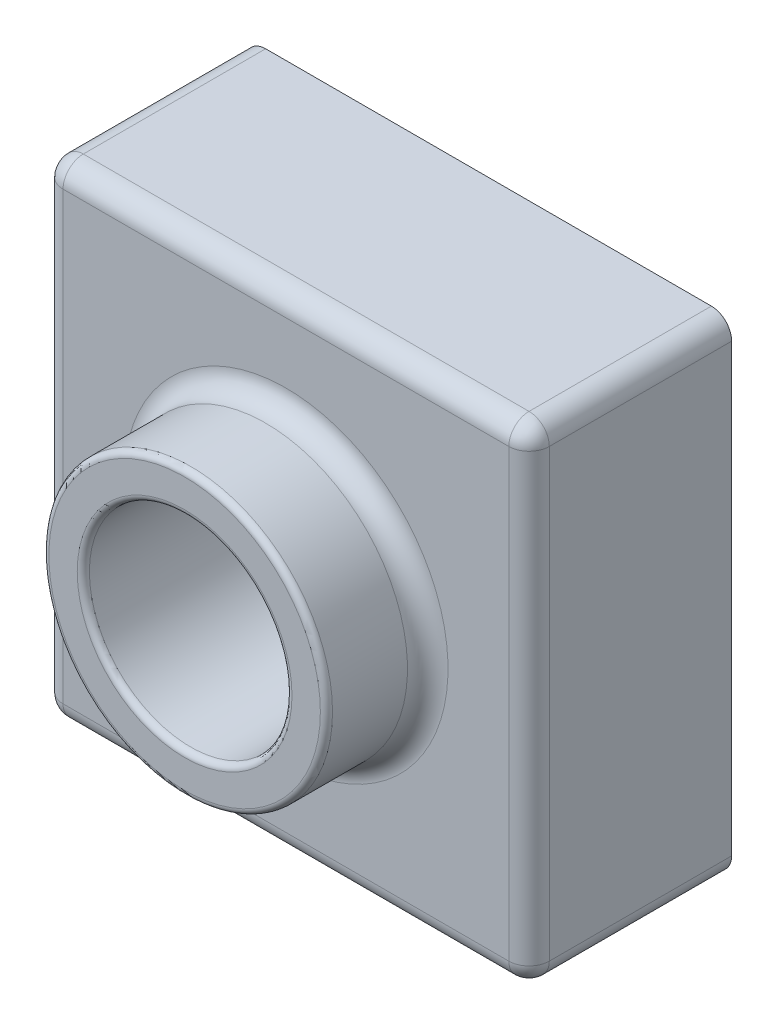
ISO-10303-21;
HEADER;
FILE_DESCRIPTION(('STEP AP214'),'2;1');
FILE_NAME('part.step','',(''),(''),'','','');
FILE_SCHEMA(('AUTOMOTIVE_DESIGN { 1 0 10303 214 1 1 1 1 }'));
ENDSEC;
DATA;
#1=APPLICATION_CONTEXT('core data for automotive mechanical design processes');
#2=APPLICATION_PROTOCOL_DEFINITION('international standard','automotive_design',2000,#1);
#3=PRODUCT_CONTEXT('',#1,'mechanical');
#4=PRODUCT('Part','Part','',(#3));
#5=PRODUCT_RELATED_PRODUCT_CATEGORY('part','',(#4));
#6=PRODUCT_DEFINITION_FORMATION('','',#4);
#7=PRODUCT_DEFINITION_CONTEXT('part definition',#1,'design');
#8=PRODUCT_DEFINITION('design','',#6,#7);
#9=PRODUCT_DEFINITION_SHAPE('','',#8);
#10=(LENGTH_UNIT() NAMED_UNIT(*) SI_UNIT(.MILLI.,.METRE.));
#11=(NAMED_UNIT(*) PLANE_ANGLE_UNIT() SI_UNIT($,.RADIAN.));
#12=(NAMED_UNIT(*) SI_UNIT($,.STERADIAN.) SOLID_ANGLE_UNIT());
#13=UNCERTAINTY_MEASURE_WITH_UNIT(LENGTH_MEASURE(1.E-05),#10,'distance_accuracy_value','');
#14=(GEOMETRIC_REPRESENTATION_CONTEXT(3) GLOBAL_UNCERTAINTY_ASSIGNED_CONTEXT((#13)) GLOBAL_UNIT_ASSIGNED_CONTEXT((#10,
#11,#12)) REPRESENTATION_CONTEXT('',''));
#15=CARTESIAN_POINT('',(0.,0.,0.));
#16=DIRECTION('',(0.,0.,1.));
#17=DIRECTION('',(1.,0.,0.));
#18=AXIS2_PLACEMENT_3D('',#15,#16,#17);
#19=CARTESIAN_POINT('',(0.,0.,0.));
#20=DIRECTION('',(0.,0.,-1.));
#21=DIRECTION('',(-1.,0.,0.));
#22=AXIS2_PLACEMENT_3D('',#19,#20,#21);
#23=PLANE('',#22);
#24=DIRECTION('',(0.,1.,0.));
#25=VECTOR('',#24,1.);
#26=CARTESIAN_POINT('',(120.,0.,0.));
#27=LINE('',#26,#25);
#28=CARTESIAN_POINT('',(120.,5.,0.));
#29=VERTEX_POINT('',#28);
#30=CARTESIAN_POINT('',(120.,115.,0.));
#31=VERTEX_POINT('',#30);
#32=EDGE_CURVE('E304',#29,#31,#27,.T.);
#33=ORIENTED_EDGE('',*,*,#32,.F.);
#34=CARTESIAN_POINT('',(115.,5.,0.));
#35=DIRECTION('',(0.,0.,-1.));
#36=DIRECTION('',(-1.,0.,0.));
#37=AXIS2_PLACEMENT_3D('',#34,#35,#36);
#38=CIRCLE('',#37,5.);
#39=CARTESIAN_POINT('',(115.,0.,0.));
#40=VERTEX_POINT('',#39);
#41=EDGE_CURVE('E378',#29,#40,#38,.T.);
#42=ORIENTED_EDGE('',*,*,#41,.T.);
#43=DIRECTION('',(1.,0.,0.));
#44=VECTOR('',#43,1.);
#45=CARTESIAN_POINT('',(0.,0.,0.));
#46=LINE('',#45,#44);
#47=CARTESIAN_POINT('',(5.,0.,0.));
#48=VERTEX_POINT('',#47);
#49=EDGE_CURVE('E300',#48,#40,#46,.T.);
#50=ORIENTED_EDGE('',*,*,#49,.F.);
#51=CARTESIAN_POINT('',(5.,5.,0.));
#52=DIRECTION('',(0.,0.,-1.));
#53=DIRECTION('',(-1.,0.,0.));
#54=AXIS2_PLACEMENT_3D('',#51,#52,#53);
#55=CIRCLE('',#54,5.);
#56=CARTESIAN_POINT('',(0.,5.,0.));
#57=VERTEX_POINT('',#56);
#58=EDGE_CURVE('E369',#48,#57,#55,.T.);
#59=ORIENTED_EDGE('',*,*,#58,.T.);
#60=DIRECTION('',(0.,-1.,0.));
#61=VECTOR('',#60,1.);
#62=CARTESIAN_POINT('',(0.,0.,0.));
#63=LINE('',#62,#61);
#64=CARTESIAN_POINT('',(0.,115.,0.));
#65=VERTEX_POINT('',#64);
#66=EDGE_CURVE('E295',#65,#57,#63,.T.);
#67=ORIENTED_EDGE('',*,*,#66,.F.);
#68=CARTESIAN_POINT('',(5.,115.,0.));
#69=DIRECTION('',(0.,0.,-1.));
#70=DIRECTION('',(-1.,0.,0.));
#71=AXIS2_PLACEMENT_3D('',#68,#69,#70);
#72=CIRCLE('',#71,5.);
#73=CARTESIAN_POINT('',(5.,120.,0.));
#74=VERTEX_POINT('',#73);
#75=EDGE_CURVE('E372',#65,#74,#72,.T.);
#76=ORIENTED_EDGE('',*,*,#75,.T.);
#77=DIRECTION('',(-1.,0.,0.));
#78=VECTOR('',#77,1.);
#79=CARTESIAN_POINT('',(0.,120.,0.));
#80=LINE('',#79,#78);
#81=CARTESIAN_POINT('',(115.,120.,0.));
#82=VERTEX_POINT('',#81);
#83=EDGE_CURVE('E308',#82,#74,#80,.T.);
#84=ORIENTED_EDGE('',*,*,#83,.F.);
#85=CARTESIAN_POINT('',(115.,115.,0.));
#86=DIRECTION('',(0.,0.,-1.));
#87=DIRECTION('',(-1.,0.,0.));
#88=AXIS2_PLACEMENT_3D('',#85,#86,#87);
#89=CIRCLE('',#88,5.);
#90=EDGE_CURVE('E375',#82,#31,#89,.T.);
#91=ORIENTED_EDGE('',*,*,#90,.T.);
#92=EDGE_LOOP('',(#33,#42,#50,#59,#67,#76,#84,#91));
#93=FACE_BOUND('',#92,.T.);
#94=CARTESIAN_POINT('',(115.,5.,0.));
#95=DIRECTION('',(0.,0.,-1.));
#96=DIRECTION('',(-1.,0.,0.));
#97=AXIS2_PLACEMENT_3D('',#94,#95,#96);
#98=CIRCLE('',#97,3.);
#99=CARTESIAN_POINT('',(118.,5.,0.));
#100=VERTEX_POINT('',#99);
#101=CARTESIAN_POINT('',(115.,2.,0.));
#102=VERTEX_POINT('',#101);
#103=EDGE_CURVE('E258',#100,#102,#98,.T.);
#104=ORIENTED_EDGE('',*,*,#103,.F.);
#105=DIRECTION('',(0.,1.,0.));
#106=VECTOR('',#105,1.);
#107=CARTESIAN_POINT('',(118.,0.,0.));
#108=LINE('',#107,#106);
#109=CARTESIAN_POINT('',(118.,115.,0.));
#110=VERTEX_POINT('',#109);
#111=EDGE_CURVE('E274',#100,#110,#108,.T.);
#112=ORIENTED_EDGE('',*,*,#111,.T.);
#113=CARTESIAN_POINT('',(115.,115.,0.));
#114=DIRECTION('',(0.,0.,-1.));
#115=DIRECTION('',(-1.,0.,0.));
#116=AXIS2_PLACEMENT_3D('',#113,#114,#115);
#117=CIRCLE('',#116,3.);
#118=CARTESIAN_POINT('',(115.,118.,0.));
#119=VERTEX_POINT('',#118);
#120=EDGE_CURVE('E270',#119,#110,#117,.T.);
#121=ORIENTED_EDGE('',*,*,#120,.F.);
#122=DIRECTION('',(-1.,0.,0.));
#123=VECTOR('',#122,1.);
#124=CARTESIAN_POINT('',(0.,118.,0.));
#125=LINE('',#124,#123);
#126=CARTESIAN_POINT('',(5.,118.,0.));
#127=VERTEX_POINT('',#126);
#128=EDGE_CURVE('E59',#119,#127,#125,.T.);
#129=ORIENTED_EDGE('',*,*,#128,.T.);
#130=CARTESIAN_POINT('',(5.,115.,0.));
#131=DIRECTION('',(0.,0.,-1.));
#132=DIRECTION('',(-1.,0.,0.));
#133=AXIS2_PLACEMENT_3D('',#130,#131,#132);
#134=CIRCLE('',#133,3.);
#135=CARTESIAN_POINT('',(2.,115.,0.));
#136=VERTEX_POINT('',#135);
#137=EDGE_CURVE('E267',#136,#127,#134,.T.);
#138=ORIENTED_EDGE('',*,*,#137,.F.);
#139=DIRECTION('',(0.,-1.,0.));
#140=VECTOR('',#139,1.);
#141=CARTESIAN_POINT('',(2.,0.,0.));
#142=LINE('',#141,#140);
#143=CARTESIAN_POINT('',(2.,5.,0.));
#144=VERTEX_POINT('',#143);
#145=EDGE_CURVE('E201',#136,#144,#142,.T.);
#146=ORIENTED_EDGE('',*,*,#145,.T.);
#147=CARTESIAN_POINT('',(5.,5.,0.));
#148=DIRECTION('',(0.,0.,-1.));
#149=DIRECTION('',(-1.,0.,0.));
#150=AXIS2_PLACEMENT_3D('',#147,#148,#149);
#151=CIRCLE('',#150,3.);
#152=CARTESIAN_POINT('',(5.,2.,0.));
#153=VERTEX_POINT('',#152);
#154=EDGE_CURVE('E252',#153,#144,#151,.T.);
#155=ORIENTED_EDGE('',*,*,#154,.F.);
#156=DIRECTION('',(1.,0.,0.));
#157=VECTOR('',#156,1.);
#158=CARTESIAN_POINT('',(0.,2.,0.));
#159=LINE('',#158,#157);
#160=EDGE_CURVE('E265',#153,#102,#159,.T.);
#161=ORIENTED_EDGE('',*,*,#160,.T.);
#162=EDGE_LOOP('',(#104,#112,#121,#129,#138,#146,#155,#161));
#163=FACE_BOUND('',#162,.T.);
#164=ADVANCED_FACE('F43',(#93,#163),#23,.T.);
#165=CARTESIAN_POINT('',(0.,0.,50.));
#166=DIRECTION('',(1.,0.,0.));
#167=DIRECTION('',(0.,0.,-1.));
#168=AXIS2_PLACEMENT_3D('',#165,#166,#167);
#169=PLANE('',#168);
#170=DIRECTION('',(0.,-1.,0.));
#171=VECTOR('',#170,1.);
#172=CARTESIAN_POINT('',(0.,0.,45.));
#173=LINE('',#172,#171);
#174=CARTESIAN_POINT('',(0.,5.,45.));
#175=VERTEX_POINT('',#174);
#176=CARTESIAN_POINT('',(0.,115.,45.));
#177=VERTEX_POINT('',#176);
#178=EDGE_CURVE('E67',#175,#177,#173,.F.);
#179=ORIENTED_EDGE('',*,*,#178,.T.);
#180=DIRECTION('',(0.,0.,-1.));
#181=VECTOR('',#180,1.);
#182=CARTESIAN_POINT('',(0.,115.,50.));
#183=LINE('',#182,#181);
#184=EDGE_CURVE('E362',#177,#65,#183,.T.);
#185=ORIENTED_EDGE('',*,*,#184,.T.);
#186=ORIENTED_EDGE('',*,*,#66,.T.);
#187=DIRECTION('',(0.,0.,-1.));
#188=VECTOR('',#187,1.);
#189=CARTESIAN_POINT('',(0.,5.,50.));
#190=LINE('',#189,#188);
#191=EDGE_CURVE('E357',#57,#175,#190,.F.);
#192=ORIENTED_EDGE('',*,*,#191,.T.);
#193=EDGE_LOOP('',(#179,#185,#186,#192));
#194=FACE_BOUND('',#193,.T.);
#195=ADVANCED_FACE('F480',(#194),#169,.F.);
#196=CARTESIAN_POINT('',(0.,0.,50.));
#197=DIRECTION('',(0.,1.,0.));
#198=DIRECTION('',(0.,0.,1.));
#199=AXIS2_PLACEMENT_3D('',#196,#197,#198);
#200=PLANE('',#199);
#201=ORIENTED_EDGE('',*,*,#49,.T.);
#202=DIRECTION('',(0.,0.,-1.));
#203=VECTOR('',#202,1.);
#204=CARTESIAN_POINT('',(115.,0.,50.));
#205=LINE('',#204,#203);
#206=CARTESIAN_POINT('',(115.,0.,45.));
#207=VERTEX_POINT('',#206);
#208=EDGE_CURVE('E354',#40,#207,#205,.F.);
#209=ORIENTED_EDGE('',*,*,#208,.T.);
#210=DIRECTION('',(1.,0.,0.));
#211=VECTOR('',#210,1.);
#212=CARTESIAN_POINT('',(0.,0.,45.));
#213=LINE('',#212,#211);
#214=CARTESIAN_POINT('',(5.,0.,45.));
#215=VERTEX_POINT('',#214);
#216=EDGE_CURVE('E351',#207,#215,#213,.F.);
#217=ORIENTED_EDGE('',*,*,#216,.T.);
#218=DIRECTION('',(0.,0.,-1.));
#219=VECTOR('',#218,1.);
#220=CARTESIAN_POINT('',(5.,0.,50.));
#221=LINE('',#220,#219);
#222=EDGE_CURVE('E348',#215,#48,#221,.T.);
#223=ORIENTED_EDGE('',*,*,#222,.T.);
#224=EDGE_LOOP('',(#201,#209,#217,#223));
#225=FACE_BOUND('',#224,.T.);
#226=ADVANCED_FACE('F485',(#225),#200,.F.);
#227=CARTESIAN_POINT('',(120.,0.,50.));
#228=DIRECTION('',(-1.,0.,0.));
#229=DIRECTION('',(0.,0.,1.));
#230=AXIS2_PLACEMENT_3D('',#227,#228,#229);
#231=PLANE('',#230);
#232=DIRECTION('',(0.,1.,0.));
#233=VECTOR('',#232,1.);
#234=CARTESIAN_POINT('',(120.,0.,45.));
#235=LINE('',#234,#233);
#236=CARTESIAN_POINT('',(120.,115.,45.));
#237=VERTEX_POINT('',#236);
#238=CARTESIAN_POINT('',(120.,5.,45.));
#239=VERTEX_POINT('',#238);
#240=EDGE_CURVE('E342',#237,#239,#235,.F.);
#241=ORIENTED_EDGE('',*,*,#240,.T.);
#242=DIRECTION('',(0.,0.,-1.));
#243=VECTOR('',#242,1.);
#244=CARTESIAN_POINT('',(120.,5.,50.));
#245=LINE('',#244,#243);
#246=EDGE_CURVE('E345',#239,#29,#245,.T.);
#247=ORIENTED_EDGE('',*,*,#246,.T.);
#248=ORIENTED_EDGE('',*,*,#32,.T.);
#249=DIRECTION('',(0.,0.,-1.));
#250=VECTOR('',#249,1.);
#251=CARTESIAN_POINT('',(120.,115.,50.));
#252=LINE('',#251,#250);
#253=EDGE_CURVE('E339',#31,#237,#252,.F.);
#254=ORIENTED_EDGE('',*,*,#253,.T.);
#255=EDGE_LOOP('',(#241,#247,#248,#254));
#256=FACE_BOUND('',#255,.T.);
#257=ADVANCED_FACE('F1130',(#256),#231,.F.);
#258=CARTESIAN_POINT('',(0.,120.,50.));
#259=DIRECTION('',(0.,-1.,0.));
#260=DIRECTION('',(0.,0.,-1.));
#261=AXIS2_PLACEMENT_3D('',#258,#259,#260);
#262=PLANE('',#261);
#263=DIRECTION('',(-1.,0.,0.));
#264=VECTOR('',#263,1.);
#265=CARTESIAN_POINT('',(0.,120.,45.));
#266=LINE('',#265,#264);
#267=CARTESIAN_POINT('',(5.,120.,45.));
#268=VERTEX_POINT('',#267);
#269=CARTESIAN_POINT('',(115.,120.,45.));
#270=VERTEX_POINT('',#269);
#271=EDGE_CURVE('E332',#268,#270,#266,.F.);
#272=ORIENTED_EDGE('',*,*,#271,.T.);
#273=DIRECTION('',(0.,0.,-1.));
#274=VECTOR('',#273,1.);
#275=CARTESIAN_POINT('',(115.,120.,50.));
#276=LINE('',#275,#274);
#277=EDGE_CURVE('E336',#270,#82,#276,.T.);
#278=ORIENTED_EDGE('',*,*,#277,.T.);
#279=ORIENTED_EDGE('',*,*,#83,.T.);
#280=DIRECTION('',(0.,0.,-1.));
#281=VECTOR('',#280,1.);
#282=CARTESIAN_POINT('',(5.,120.,50.));
#283=LINE('',#282,#281);
#284=EDGE_CURVE('E329',#74,#268,#283,.F.);
#285=ORIENTED_EDGE('',*,*,#284,.T.);
#286=EDGE_LOOP('',(#272,#278,#279,#285));
#287=FACE_BOUND('',#286,.T.);
#288=ADVANCED_FACE('F474',(#287),#262,.F.);
#289=CARTESIAN_POINT('',(0.,0.,50.));
#290=DIRECTION('',(0.,0.,-1.));
#291=DIRECTION('',(-1.,0.,0.));
#292=AXIS2_PLACEMENT_3D('',#289,#290,#291);
#293=PLANE('',#292);
#294=DIRECTION('',(0.,1.,0.));
#295=VECTOR('',#294,1.);
#296=CARTESIAN_POINT('',(115.,0.,50.));
#297=LINE('',#296,#295);
#298=CARTESIAN_POINT('',(115.,5.,50.));
#299=VERTEX_POINT('',#298);
#300=CARTESIAN_POINT('',(115.,115.,50.));
#301=VERTEX_POINT('',#300);
#302=EDGE_CURVE('E322',#299,#301,#297,.T.);
#303=ORIENTED_EDGE('',*,*,#302,.T.);
#304=DIRECTION('',(-1.,0.,0.));
#305=VECTOR('',#304,1.);
#306=CARTESIAN_POINT('',(0.,115.,50.));
#307=LINE('',#306,#305);
#308=CARTESIAN_POINT('',(5.,115.,50.));
#309=VERTEX_POINT('',#308);
#310=EDGE_CURVE('E325',#301,#309,#307,.T.);
#311=ORIENTED_EDGE('',*,*,#310,.T.);
#312=DIRECTION('',(0.,-1.,0.));
#313=VECTOR('',#312,1.);
#314=CARTESIAN_POINT('',(5.,0.,50.));
#315=LINE('',#314,#313);
#316=CARTESIAN_POINT('',(5.,5.,50.));
#317=VERTEX_POINT('',#316);
#318=EDGE_CURVE('E316',#309,#317,#315,.T.);
#319=ORIENTED_EDGE('',*,*,#318,.T.);
#320=DIRECTION('',(1.,0.,0.));
#321=VECTOR('',#320,1.);
#322=CARTESIAN_POINT('',(0.,5.,50.));
#323=LINE('',#322,#321);
#324=EDGE_CURVE('E319',#317,#299,#323,.T.);
#325=ORIENTED_EDGE('',*,*,#324,.T.);
#326=EDGE_LOOP('',(#303,#311,#319,#325));
#327=FACE_BOUND('',#326,.T.);
#328=CARTESIAN_POINT('',(60.,60.,50.));
#329=DIRECTION('',(0.,0.,-1.));
#330=DIRECTION('',(-1.,0.,0.));
#331=AXIS2_PLACEMENT_3D('',#328,#329,#330);
#332=CIRCLE('',#331,40.);
#333=CARTESIAN_POINT('',(20.,60.,50.));
#334=VERTEX_POINT('',#333);
#335=EDGE_CURVE('E312',#334,#334,#332,.T.);
#336=ORIENTED_EDGE('',*,*,#335,.T.);
#337=EDGE_LOOP('',(#336));
#338=FACE_BOUND('',#337,.T.);
#339=ADVANCED_FACE('F466',(#327,#338),#293,.F.);
#340=CARTESIAN_POINT('',(60.,60.,0.));
#341=DIRECTION('',(0.,0.,-1.));
#342=DIRECTION('',(-1.,0.,0.));
#343=AXIS2_PLACEMENT_3D('',#340,#341,#342);
#344=CIRCLE('',#343,27.);
#345=CARTESIAN_POINT('',(33.,60.,0.));
#346=VERTEX_POINT('',#345);
#347=EDGE_CURVE('E266',#346,#346,#344,.F.);
#348=ORIENTED_EDGE('',*,*,#347,.F.);
#349=EDGE_LOOP('',(#348));
#350=FACE_BOUND('',#349,.T.);
#351=CARTESIAN_POINT('',(60.,60.,0.));
#352=DIRECTION('',(0.,0.,1.));
#353=DIRECTION('',(1.,0.,0.));
#354=AXIS2_PLACEMENT_3D('',#351,#352,#353);
#355=CIRCLE('',#354,25.);
#356=CARTESIAN_POINT('',(85.,60.,0.));
#357=VERTEX_POINT('',#356);
#358=EDGE_CURVE('E291',#357,#357,#355,.T.);
#359=ORIENTED_EDGE('',*,*,#358,.T.);
#360=EDGE_LOOP('',(#359));
#361=FACE_BOUND('',#360,.T.);
#362=ADVANCED_FACE('F464',(#350,#361),#23,.T.);
#363=CARTESIAN_POINT('',(60.,60.,75.));
#364=DIRECTION('',(0.,0.,-1.));
#365=DIRECTION('',(-1.,0.,0.));
#366=AXIS2_PLACEMENT_3D('',#363,#364,#365);
#367=CYLINDRICAL_SURFACE('',#366,35.);
#368=CARTESIAN_POINT('',(60.,60.,73.5));
#369=DIRECTION('',(0.,0.,1.));
#370=DIRECTION('',(1.,0.,0.));
#371=AXIS2_PLACEMENT_3D('',#368,#369,#370);
#372=CIRCLE('',#371,35.);
#373=CARTESIAN_POINT('',(95.,60.,73.5));
#374=VERTEX_POINT('',#373);
#375=EDGE_CURVE('E52',#374,#374,#372,.F.);
#376=ORIENTED_EDGE('',*,*,#375,.T.);
#377=EDGE_LOOP('',(#376));
#378=FACE_BOUND('',#377,.T.);
#379=CARTESIAN_POINT('',(60.,60.,55.));
#380=DIRECTION('',(0.,0.,-1.));
#381=DIRECTION('',(-1.,0.,0.));
#382=AXIS2_PLACEMENT_3D('',#379,#380,#381);
#383=CIRCLE('',#382,35.);
#384=CARTESIAN_POINT('',(25.,60.,55.));
#385=VERTEX_POINT('',#384);
#386=EDGE_CURVE('E365',#385,#385,#383,.F.);
#387=ORIENTED_EDGE('',*,*,#386,.T.);
#388=EDGE_LOOP('',(#387));
#389=FACE_BOUND('',#388,.T.);
#390=ADVANCED_FACE('F438',(#378,#389),#367,.T.);
#391=CARTESIAN_POINT('',(60.,60.,75.));
#392=DIRECTION('',(0.,0.,1.));
#393=DIRECTION('',(1.,0.,0.));
#394=AXIS2_PLACEMENT_3D('',#391,#392,#393);
#395=PLANE('',#394);
#396=CARTESIAN_POINT('',(60.,60.,75.));
#397=DIRECTION('',(0.,0.,1.));
#398=DIRECTION('',(1.,0.,0.));
#399=AXIS2_PLACEMENT_3D('',#396,#397,#398);
#400=CIRCLE('',#399,33.5);
#401=CARTESIAN_POINT('',(93.5,60.,75.));
#402=VERTEX_POINT('',#401);
#403=EDGE_CURVE('E429',#402,#402,#400,.T.);
#404=ORIENTED_EDGE('',*,*,#403,.T.);
#405=EDGE_LOOP('',(#404));
#406=FACE_BOUND('',#405,.T.);
#407=CARTESIAN_POINT('',(60.,60.,75.));
#408=DIRECTION('',(0.,0.,1.));
#409=DIRECTION('',(1.,0.,0.));
#410=AXIS2_PLACEMENT_3D('',#407,#408,#409);
#411=CIRCLE('',#410,26.5);
#412=CARTESIAN_POINT('',(86.5,60.,75.));
#413=VERTEX_POINT('',#412);
#414=EDGE_CURVE('E381',#413,#413,#411,.F.);
#415=ORIENTED_EDGE('',*,*,#414,.T.);
#416=EDGE_LOOP('',(#415));
#417=FACE_BOUND('',#416,.T.);
#418=ADVANCED_FACE('F447',(#406,#417),#395,.T.);
#419=CARTESIAN_POINT('',(60.,60.,0.));
#420=DIRECTION('',(0.,0.,1.));
#421=DIRECTION('',(1.,0.,0.));
#422=AXIS2_PLACEMENT_3D('',#419,#420,#421);
#423=CYLINDRICAL_SURFACE('',#422,25.);
#424=CARTESIAN_POINT('',(60.,60.,73.5));
#425=DIRECTION('',(0.,0.,1.));
#426=DIRECTION('',(1.,0.,0.));
#427=AXIS2_PLACEMENT_3D('',#424,#425,#426);
#428=CIRCLE('',#427,25.);
#429=CARTESIAN_POINT('',(85.,60.,73.5));
#430=VERTEX_POINT('',#429);
#431=EDGE_CURVE('E11',#430,#430,#428,.T.);
#432=ORIENTED_EDGE('',*,*,#431,.T.);
#433=EDGE_LOOP('',(#432));
#434=FACE_BOUND('',#433,.T.);
#435=ORIENTED_EDGE('',*,*,#358,.F.);
#436=EDGE_LOOP('',(#435));
#437=FACE_BOUND('',#436,.T.);
#438=ADVANCED_FACE('F450',(#434,#437),#423,.F.);
#439=CARTESIAN_POINT('',(115.,5.,50.));
#440=DIRECTION('',(0.,0.,-1.));
#441=DIRECTION('',(-1.,0.,0.));
#442=AXIS2_PLACEMENT_3D('',#439,#440,#441);
#443=CYLINDRICAL_SURFACE('',#442,5.);
#444=ORIENTED_EDGE('',*,*,#41,.F.);
#445=ORIENTED_EDGE('',*,*,#246,.F.);
#446=CARTESIAN_POINT('',(115.,5.,45.));
#447=DIRECTION('',(0.,0.,1.));
#448=DIRECTION('',(1.,0.,0.));
#449=AXIS2_PLACEMENT_3D('',#446,#447,#448);
#450=CIRCLE('',#449,5.);
#451=EDGE_CURVE('E296',#207,#239,#450,.T.);
#452=ORIENTED_EDGE('',*,*,#451,.F.);
#453=ORIENTED_EDGE('',*,*,#208,.F.);
#454=EDGE_LOOP('',(#444,#445,#452,#453));
#455=FACE_BOUND('',#454,.T.);
#456=ADVANCED_FACE('F460',(#455),#443,.T.);
#457=CARTESIAN_POINT('',(0.,5.,45.));
#458=DIRECTION('',(1.,0.,0.));
#459=DIRECTION('',(0.,0.,-1.));
#460=AXIS2_PLACEMENT_3D('',#457,#458,#459);
#461=CYLINDRICAL_SURFACE('',#460,5.);
#462=CARTESIAN_POINT('',(5.,5.,45.));
#463=DIRECTION('',(-1.,0.,0.));
#464=DIRECTION('',(0.,0.,1.));
#465=AXIS2_PLACEMENT_3D('',#462,#463,#464);
#466=CIRCLE('',#465,5.);
#467=EDGE_CURVE('E415',#215,#317,#466,.T.);
#468=ORIENTED_EDGE('',*,*,#467,.F.);
#469=ORIENTED_EDGE('',*,*,#216,.F.);
#470=CARTESIAN_POINT('',(115.,5.,45.));
#471=DIRECTION('',(1.,0.,0.));
#472=DIRECTION('',(0.,0.,-1.));
#473=AXIS2_PLACEMENT_3D('',#470,#471,#472);
#474=CIRCLE('',#473,5.);
#475=EDGE_CURVE('E419',#299,#207,#474,.T.);
#476=ORIENTED_EDGE('',*,*,#475,.F.);
#477=ORIENTED_EDGE('',*,*,#324,.F.);
#478=EDGE_LOOP('',(#468,#469,#476,#477));
#479=FACE_BOUND('',#478,.T.);
#480=ADVANCED_FACE('F1076',(#479),#461,.T.);
#481=CARTESIAN_POINT('',(5.,5.,50.));
#482=DIRECTION('',(0.,0.,-1.));
#483=DIRECTION('',(-1.,0.,0.));
#484=AXIS2_PLACEMENT_3D('',#481,#482,#483);
#485=CYLINDRICAL_SURFACE('',#484,5.);
#486=ORIENTED_EDGE('',*,*,#58,.F.);
#487=ORIENTED_EDGE('',*,*,#222,.F.);
#488=CARTESIAN_POINT('',(5.,5.,45.));
#489=DIRECTION('',(0.,0.,1.));
#490=DIRECTION('',(1.,0.,0.));
#491=AXIS2_PLACEMENT_3D('',#488,#489,#490);
#492=CIRCLE('',#491,5.);
#493=EDGE_CURVE('E411',#175,#215,#492,.T.);
#494=ORIENTED_EDGE('',*,*,#493,.F.);
#495=ORIENTED_EDGE('',*,*,#191,.F.);
#496=EDGE_LOOP('',(#486,#487,#494,#495));
#497=FACE_BOUND('',#496,.T.);
#498=ADVANCED_FACE('F1066',(#497),#485,.T.);
#499=CARTESIAN_POINT('',(115.,5.,45.));
#500=DIRECTION('',(0.,-1.,0.));
#501=DIRECTION('',(0.,0.,-1.));
#502=AXIS2_PLACEMENT_3D('',#499,#500,#501);
#503=SPHERICAL_SURFACE('',#502,5.);
#504=ORIENTED_EDGE('',*,*,#475,.T.);
#505=ORIENTED_EDGE('',*,*,#451,.T.);
#506=CARTESIAN_POINT('',(115.,5.,45.));
#507=DIRECTION('',(0.,-1.,0.));
#508=DIRECTION('',(0.,0.,-1.));
#509=AXIS2_PLACEMENT_3D('',#506,#507,#508);
#510=CIRCLE('',#509,5.);
#511=EDGE_CURVE('E407',#299,#239,#510,.F.);
#512=ORIENTED_EDGE('',*,*,#511,.F.);
#513=EDGE_LOOP('',(#504,#505,#512));
#514=FACE_BOUND('',#513,.T.);
#515=ADVANCED_FACE('F1056',(#514),#503,.T.);
#516=CARTESIAN_POINT('',(5.,5.,45.));
#517=DIRECTION('',(0.,-1.,0.));
#518=DIRECTION('',(0.,0.,-1.));
#519=AXIS2_PLACEMENT_3D('',#516,#517,#518);
#520=SPHERICAL_SURFACE('',#519,5.);
#521=ORIENTED_EDGE('',*,*,#493,.T.);
#522=ORIENTED_EDGE('',*,*,#467,.T.);
#523=CARTESIAN_POINT('',(5.,5.,45.));
#524=DIRECTION('',(0.,-1.,0.));
#525=DIRECTION('',(0.,0.,-1.));
#526=AXIS2_PLACEMENT_3D('',#523,#524,#525);
#527=CIRCLE('',#526,5.);
#528=EDGE_CURVE('E403',#175,#317,#527,.F.);
#529=ORIENTED_EDGE('',*,*,#528,.F.);
#530=EDGE_LOOP('',(#521,#522,#529));
#531=FACE_BOUND('',#530,.T.);
#532=ADVANCED_FACE('F1046',(#531),#520,.T.);
#533=CARTESIAN_POINT('',(115.,115.,50.));
#534=DIRECTION('',(0.,0.,-1.));
#535=DIRECTION('',(-1.,0.,0.));
#536=AXIS2_PLACEMENT_3D('',#533,#534,#535);
#537=CYLINDRICAL_SURFACE('',#536,5.);
#538=ORIENTED_EDGE('',*,*,#90,.F.);
#539=ORIENTED_EDGE('',*,*,#277,.F.);
#540=CARTESIAN_POINT('',(115.,115.,45.));
#541=DIRECTION('',(0.,0.,1.));
#542=DIRECTION('',(1.,0.,0.));
#543=AXIS2_PLACEMENT_3D('',#540,#541,#542);
#544=CIRCLE('',#543,5.);
#545=EDGE_CURVE('E399',#237,#270,#544,.T.);
#546=ORIENTED_EDGE('',*,*,#545,.F.);
#547=ORIENTED_EDGE('',*,*,#253,.F.);
#548=EDGE_LOOP('',(#538,#539,#546,#547));
#549=FACE_BOUND('',#548,.T.);
#550=ADVANCED_FACE('F1036',(#549),#537,.T.);
#551=CARTESIAN_POINT('',(115.,0.,45.));
#552=DIRECTION('',(0.,1.,0.));
#553=DIRECTION('',(0.,0.,1.));
#554=AXIS2_PLACEMENT_3D('',#551,#552,#553);
#555=CYLINDRICAL_SURFACE('',#554,5.);
#556=ORIENTED_EDGE('',*,*,#511,.T.);
#557=ORIENTED_EDGE('',*,*,#240,.F.);
#558=CARTESIAN_POINT('',(115.,115.,45.));
#559=DIRECTION('',(0.,1.,0.));
#560=DIRECTION('',(0.,0.,1.));
#561=AXIS2_PLACEMENT_3D('',#558,#559,#560);
#562=CIRCLE('',#561,5.);
#563=EDGE_CURVE('E395',#301,#237,#562,.T.);
#564=ORIENTED_EDGE('',*,*,#563,.F.);
#565=ORIENTED_EDGE('',*,*,#302,.F.);
#566=EDGE_LOOP('',(#556,#557,#564,#565));
#567=FACE_BOUND('',#566,.T.);
#568=ADVANCED_FACE('F1026',(#567),#555,.T.);
#569=CARTESIAN_POINT('',(5.,0.,45.));
#570=DIRECTION('',(0.,-1.,0.));
#571=DIRECTION('',(0.,0.,-1.));
#572=AXIS2_PLACEMENT_3D('',#569,#570,#571);
#573=CYLINDRICAL_SURFACE('',#572,5.);
#574=ORIENTED_EDGE('',*,*,#528,.T.);
#575=ORIENTED_EDGE('',*,*,#318,.F.);
#576=CARTESIAN_POINT('',(5.,115.,45.));
#577=DIRECTION('',(0.,1.,0.));
#578=DIRECTION('',(0.,0.,1.));
#579=AXIS2_PLACEMENT_3D('',#576,#577,#578);
#580=CIRCLE('',#579,5.);
#581=EDGE_CURVE('E391',#177,#309,#580,.T.);
#582=ORIENTED_EDGE('',*,*,#581,.F.);
#583=ORIENTED_EDGE('',*,*,#178,.F.);
#584=EDGE_LOOP('',(#574,#575,#582,#583));
#585=FACE_BOUND('',#584,.T.);
#586=ADVANCED_FACE('F1016',(#585),#573,.T.);
#587=CARTESIAN_POINT('',(5.,115.,50.));
#588=DIRECTION('',(0.,0.,-1.));
#589=DIRECTION('',(-1.,0.,0.));
#590=AXIS2_PLACEMENT_3D('',#587,#588,#589);
#591=CYLINDRICAL_SURFACE('',#590,5.);
#592=ORIENTED_EDGE('',*,*,#75,.F.);
#593=ORIENTED_EDGE('',*,*,#184,.F.);
#594=CARTESIAN_POINT('',(5.,115.,45.));
#595=DIRECTION('',(0.,0.,1.));
#596=DIRECTION('',(1.,0.,0.));
#597=AXIS2_PLACEMENT_3D('',#594,#595,#596);
#598=CIRCLE('',#597,5.);
#599=EDGE_CURVE('E387',#268,#177,#598,.T.);
#600=ORIENTED_EDGE('',*,*,#599,.F.);
#601=ORIENTED_EDGE('',*,*,#284,.F.);
#602=EDGE_LOOP('',(#592,#593,#600,#601));
#603=FACE_BOUND('',#602,.T.);
#604=ADVANCED_FACE('F1006',(#603),#591,.T.);
#605=CARTESIAN_POINT('',(115.,115.,45.));
#606=DIRECTION('',(1.,0.,0.));
#607=DIRECTION('',(0.,0.,-1.));
#608=AXIS2_PLACEMENT_3D('',#605,#606,#607);
#609=SPHERICAL_SURFACE('',#608,5.);
#610=ORIENTED_EDGE('',*,*,#563,.T.);
#611=ORIENTED_EDGE('',*,*,#545,.T.);
#612=CARTESIAN_POINT('',(115.,115.,45.));
#613=DIRECTION('',(1.,0.,0.));
#614=DIRECTION('',(0.,0.,-1.));
#615=AXIS2_PLACEMENT_3D('',#612,#613,#614);
#616=CIRCLE('',#615,5.);
#617=EDGE_CURVE('E384',#301,#270,#616,.F.);
#618=ORIENTED_EDGE('',*,*,#617,.F.);
#619=EDGE_LOOP('',(#610,#611,#618));
#620=FACE_BOUND('',#619,.T.);
#621=ADVANCED_FACE('F996',(#620),#609,.T.);
#622=CARTESIAN_POINT('',(5.,115.,45.));
#623=DIRECTION('',(-1.,0.,0.));
#624=DIRECTION('',(0.,0.,1.));
#625=AXIS2_PLACEMENT_3D('',#622,#623,#624);
#626=SPHERICAL_SURFACE('',#625,5.);
#627=ORIENTED_EDGE('',*,*,#599,.T.);
#628=ORIENTED_EDGE('',*,*,#581,.T.);
#629=CARTESIAN_POINT('',(5.,115.,45.));
#630=DIRECTION('',(-1.,0.,0.));
#631=DIRECTION('',(0.,0.,1.));
#632=AXIS2_PLACEMENT_3D('',#629,#630,#631);
#633=CIRCLE('',#632,5.);
#634=EDGE_CURVE('E262',#268,#309,#633,.F.);
#635=ORIENTED_EDGE('',*,*,#634,.F.);
#636=EDGE_LOOP('',(#627,#628,#635));
#637=FACE_BOUND('',#636,.T.);
#638=ADVANCED_FACE('F986',(#637),#626,.T.);
#639=CARTESIAN_POINT('',(0.,115.,45.));
#640=DIRECTION('',(-1.,0.,0.));
#641=DIRECTION('',(0.,0.,1.));
#642=AXIS2_PLACEMENT_3D('',#639,#640,#641);
#643=CYLINDRICAL_SURFACE('',#642,5.);
#644=ORIENTED_EDGE('',*,*,#617,.T.);
#645=ORIENTED_EDGE('',*,*,#271,.F.);
#646=ORIENTED_EDGE('',*,*,#634,.T.);
#647=ORIENTED_EDGE('',*,*,#310,.F.);
#648=EDGE_LOOP('',(#644,#645,#646,#647));
#649=FACE_BOUND('',#648,.T.);
#650=ADVANCED_FACE('F975',(#649),#643,.T.);
#651=CARTESIAN_POINT('',(60.,60.,55.));
#652=DIRECTION('',(0.,0.,-1.));
#653=DIRECTION('',(-1.,0.,0.));
#654=AXIS2_PLACEMENT_3D('',#651,#652,#653);
#655=TOROIDAL_SURFACE('',#654,40.,5.);
#656=ORIENTED_EDGE('',*,*,#335,.F.);
#657=EDGE_LOOP('',(#656));
#658=FACE_BOUND('',#657,.T.);
#659=ORIENTED_EDGE('',*,*,#386,.F.);
#660=EDGE_LOOP('',(#659));
#661=FACE_BOUND('',#660,.T.);
#662=ADVANCED_FACE('F444',(#658,#661),#655,.F.);
#663=CARTESIAN_POINT('',(60.,60.,73.5));
#664=DIRECTION('',(0.,0.,1.));
#665=DIRECTION('',(1.,0.,0.));
#666=AXIS2_PLACEMENT_3D('',#663,#664,#665);
#667=TOROIDAL_SURFACE('',#666,33.5,1.5);
#668=ORIENTED_EDGE('',*,*,#375,.F.);
#669=EDGE_LOOP('',(#668));
#670=FACE_BOUND('',#669,.T.);
#671=ORIENTED_EDGE('',*,*,#403,.F.);
#672=EDGE_LOOP('',(#671));
#673=FACE_BOUND('',#672,.T.);
#674=ADVANCED_FACE('F441',(#670,#673),#667,.T.);
#675=CARTESIAN_POINT('',(60.,60.,73.5));
#676=DIRECTION('',(0.,0.,1.));
#677=DIRECTION('',(1.,0.,0.));
#678=AXIS2_PLACEMENT_3D('',#675,#676,#677);
#679=TOROIDAL_SURFACE('',#678,26.5,1.5);
#680=ORIENTED_EDGE('',*,*,#414,.F.);
#681=EDGE_LOOP('',(#680));
#682=FACE_BOUND('',#681,.T.);
#683=ORIENTED_EDGE('',*,*,#431,.F.);
#684=EDGE_LOOP('',(#683));
#685=FACE_BOUND('',#684,.T.);
#686=ADVANCED_FACE('F45',(#682,#685),#679,.T.);
#687=CARTESIAN_POINT('',(2.,0.,50.));
#688=DIRECTION('',(1.,0.,0.));
#689=DIRECTION('',(0.,0.,-1.));
#690=AXIS2_PLACEMENT_3D('',#687,#688,#689);
#691=PLANE('',#690);
#692=DIRECTION('',(0.,1.,0.));
#693=VECTOR('',#692,1.);
#694=CARTESIAN_POINT('',(2.,0.,45.));
#695=LINE('',#694,#693);
#696=CARTESIAN_POINT('',(2.,5.,45.));
#697=VERTEX_POINT('',#696);
#698=CARTESIAN_POINT('',(2.,115.,45.));
#699=VERTEX_POINT('',#698);
#700=EDGE_CURVE('E184',#697,#699,#695,.T.);
#701=ORIENTED_EDGE('',*,*,#700,.F.);
#702=DIRECTION('',(0.,0.,-1.));
#703=VECTOR('',#702,1.);
#704=CARTESIAN_POINT('',(2.,5.,50.));
#705=LINE('',#704,#703);
#706=EDGE_CURVE('E196',#144,#697,#705,.F.);
#707=ORIENTED_EDGE('',*,*,#706,.F.);
#708=ORIENTED_EDGE('',*,*,#145,.F.);
#709=DIRECTION('',(0.,0.,-1.));
#710=VECTOR('',#709,1.);
#711=CARTESIAN_POINT('',(2.,115.,50.));
#712=LINE('',#711,#710);
#713=EDGE_CURVE('E195',#699,#136,#712,.T.);
#714=ORIENTED_EDGE('',*,*,#713,.F.);
#715=EDGE_LOOP('',(#701,#707,#708,#714));
#716=FACE_BOUND('',#715,.T.);
#717=ADVANCED_FACE('F199',(#716),#691,.T.);
#718=CARTESIAN_POINT('',(0.,2.,50.));
#719=DIRECTION('',(0.,1.,0.));
#720=DIRECTION('',(0.,0.,1.));
#721=AXIS2_PLACEMENT_3D('',#718,#719,#720);
#722=PLANE('',#721);
#723=ORIENTED_EDGE('',*,*,#160,.F.);
#724=DIRECTION('',(0.,0.,1.));
#725=VECTOR('',#724,1.);
#726=CARTESIAN_POINT('',(5.,2.,50.));
#727=LINE('',#726,#725);
#728=CARTESIAN_POINT('',(5.,2.,45.));
#729=VERTEX_POINT('',#728);
#730=EDGE_CURVE('E515',#729,#153,#727,.F.);
#731=ORIENTED_EDGE('',*,*,#730,.F.);
#732=DIRECTION('',(1.,0.,0.));
#733=VECTOR('',#732,1.);
#734=CARTESIAN_POINT('',(0.,2.,45.));
#735=LINE('',#734,#733);
#736=CARTESIAN_POINT('',(115.,2.,45.));
#737=VERTEX_POINT('',#736);
#738=EDGE_CURVE('E506',#737,#729,#735,.F.);
#739=ORIENTED_EDGE('',*,*,#738,.F.);
#740=DIRECTION('',(0.,0.,1.));
#741=VECTOR('',#740,1.);
#742=CARTESIAN_POINT('',(115.,2.,50.));
#743=LINE('',#742,#741);
#744=EDGE_CURVE('E499',#102,#737,#743,.T.);
#745=ORIENTED_EDGE('',*,*,#744,.F.);
#746=EDGE_LOOP('',(#723,#731,#739,#745));
#747=FACE_BOUND('',#746,.T.);
#748=ADVANCED_FACE('F504',(#747),#722,.T.);
#749=CARTESIAN_POINT('',(118.,0.,50.));
#750=DIRECTION('',(-1.,0.,0.));
#751=DIRECTION('',(0.,0.,1.));
#752=AXIS2_PLACEMENT_3D('',#749,#750,#751);
#753=PLANE('',#752);
#754=DIRECTION('',(0.,1.,0.));
#755=VECTOR('',#754,1.);
#756=CARTESIAN_POINT('',(118.,0.,45.));
#757=LINE('',#756,#755);
#758=CARTESIAN_POINT('',(118.,115.,45.));
#759=VERTEX_POINT('',#758);
#760=CARTESIAN_POINT('',(118.,5.,45.));
#761=VERTEX_POINT('',#760);
#762=EDGE_CURVE('E523',#759,#761,#757,.F.);
#763=ORIENTED_EDGE('',*,*,#762,.F.);
#764=DIRECTION('',(0.,0.,1.));
#765=VECTOR('',#764,1.);
#766=CARTESIAN_POINT('',(118.,115.,50.));
#767=LINE('',#766,#765);
#768=EDGE_CURVE('E239',#110,#759,#767,.T.);
#769=ORIENTED_EDGE('',*,*,#768,.F.);
#770=ORIENTED_EDGE('',*,*,#111,.F.);
#771=DIRECTION('',(0.,0.,1.));
#772=VECTOR('',#771,1.);
#773=CARTESIAN_POINT('',(118.,5.,50.));
#774=LINE('',#773,#772);
#775=EDGE_CURVE('E502',#761,#100,#774,.F.);
#776=ORIENTED_EDGE('',*,*,#775,.F.);
#777=EDGE_LOOP('',(#763,#769,#770,#776));
#778=FACE_BOUND('',#777,.T.);
#779=ADVANCED_FACE('F751',(#778),#753,.T.);
#780=CARTESIAN_POINT('',(0.,118.,50.));
#781=DIRECTION('',(0.,-1.,0.));
#782=DIRECTION('',(0.,0.,-1.));
#783=AXIS2_PLACEMENT_3D('',#780,#781,#782);
#784=PLANE('',#783);
#785=DIRECTION('',(1.,0.,0.));
#786=VECTOR('',#785,1.);
#787=CARTESIAN_POINT('',(0.,118.,45.));
#788=LINE('',#787,#786);
#789=CARTESIAN_POINT('',(5.,118.,45.));
#790=VERTEX_POINT('',#789);
#791=CARTESIAN_POINT('',(115.,118.,45.));
#792=VERTEX_POINT('',#791);
#793=EDGE_CURVE('E231',#790,#792,#788,.T.);
#794=ORIENTED_EDGE('',*,*,#793,.F.);
#795=DIRECTION('',(0.,0.,-1.));
#796=VECTOR('',#795,1.);
#797=CARTESIAN_POINT('',(5.,118.,50.));
#798=LINE('',#797,#796);
#799=EDGE_CURVE('E219',#127,#790,#798,.F.);
#800=ORIENTED_EDGE('',*,*,#799,.F.);
#801=ORIENTED_EDGE('',*,*,#128,.F.);
#802=DIRECTION('',(0.,0.,-1.));
#803=VECTOR('',#802,1.);
#804=CARTESIAN_POINT('',(115.,118.,50.));
#805=LINE('',#804,#803);
#806=EDGE_CURVE('E236',#792,#119,#805,.T.);
#807=ORIENTED_EDGE('',*,*,#806,.F.);
#808=EDGE_LOOP('',(#794,#800,#801,#807));
#809=FACE_BOUND('',#808,.T.);
#810=ADVANCED_FACE('F728',(#809),#784,.T.);
#811=CARTESIAN_POINT('',(0.,0.,48.));
#812=DIRECTION('',(0.,0.,-1.));
#813=DIRECTION('',(-1.,0.,0.));
#814=AXIS2_PLACEMENT_3D('',#811,#812,#813);
#815=PLANE('',#814);
#816=DIRECTION('',(0.,1.,0.));
#817=VECTOR('',#816,1.);
#818=CARTESIAN_POINT('',(115.,0.,48.));
#819=LINE('',#818,#817);
#820=CARTESIAN_POINT('',(115.,5.,48.));
#821=VERTEX_POINT('',#820);
#822=CARTESIAN_POINT('',(115.,115.,48.));
#823=VERTEX_POINT('',#822);
#824=EDGE_CURVE('E539',#821,#823,#819,.T.);
#825=ORIENTED_EDGE('',*,*,#824,.F.);
#826=DIRECTION('',(-1.,0.,0.));
#827=VECTOR('',#826,1.);
#828=CARTESIAN_POINT('',(0.,5.,48.));
#829=LINE('',#828,#827);
#830=CARTESIAN_POINT('',(5.,5.,48.));
#831=VERTEX_POINT('',#830);
#832=EDGE_CURVE('E542',#831,#821,#829,.F.);
#833=ORIENTED_EDGE('',*,*,#832,.F.);
#834=DIRECTION('',(0.,1.,0.));
#835=VECTOR('',#834,1.);
#836=CARTESIAN_POINT('',(5.,0.,48.));
#837=LINE('',#836,#835);
#838=CARTESIAN_POINT('',(5.,115.,48.));
#839=VERTEX_POINT('',#838);
#840=EDGE_CURVE('E546',#839,#831,#837,.F.);
#841=ORIENTED_EDGE('',*,*,#840,.F.);
#842=DIRECTION('',(-1.,0.,0.));
#843=VECTOR('',#842,1.);
#844=CARTESIAN_POINT('',(0.,115.,48.));
#845=LINE('',#844,#843);
#846=EDGE_CURVE('E232',#823,#839,#845,.T.);
#847=ORIENTED_EDGE('',*,*,#846,.F.);
#848=EDGE_LOOP('',(#825,#833,#841,#847));
#849=FACE_BOUND('',#848,.T.);
#850=CARTESIAN_POINT('',(60.,60.,48.));
#851=DIRECTION('',(0.,0.,-1.));
#852=DIRECTION('',(-1.,0.,0.));
#853=AXIS2_PLACEMENT_3D('',#850,#851,#852);
#854=CIRCLE('',#853,40.);
#855=CARTESIAN_POINT('',(20.,60.,48.));
#856=VERTEX_POINT('',#855);
#857=EDGE_CURVE('E273',#856,#856,#854,.T.);
#858=ORIENTED_EDGE('',*,*,#857,.F.);
#859=EDGE_LOOP('',(#858));
#860=FACE_BOUND('',#859,.T.);
#861=ADVANCED_FACE('F735',(#849,#860),#815,.T.);
#862=CARTESIAN_POINT('',(60.,60.,75.));
#863=DIRECTION('',(0.,0.,-1.));
#864=DIRECTION('',(-1.,0.,0.));
#865=AXIS2_PLACEMENT_3D('',#862,#863,#864);
#866=CYLINDRICAL_SURFACE('',#865,33.);
#867=CARTESIAN_POINT('',(60.,60.,73.));
#868=DIRECTION('',(0.,0.,1.));
#869=DIRECTION('',(1.,0.,0.));
#870=AXIS2_PLACEMENT_3D('',#867,#868,#869);
#871=CIRCLE('',#870,33.);
#872=CARTESIAN_POINT('',(93.,60.,73.));
#873=VERTEX_POINT('',#872);
#874=EDGE_CURVE('E253',#873,#873,#871,.T.);
#875=ORIENTED_EDGE('',*,*,#874,.T.);
#876=EDGE_LOOP('',(#875));
#877=FACE_BOUND('',#876,.T.);
#878=CARTESIAN_POINT('',(60.,60.,55.));
#879=DIRECTION('',(0.,0.,-1.));
#880=DIRECTION('',(-1.,0.,0.));
#881=AXIS2_PLACEMENT_3D('',#878,#879,#880);
#882=CIRCLE('',#881,33.);
#883=CARTESIAN_POINT('',(27.,60.,55.));
#884=VERTEX_POINT('',#883);
#885=EDGE_CURVE('E206',#884,#884,#882,.F.);
#886=ORIENTED_EDGE('',*,*,#885,.F.);
#887=EDGE_LOOP('',(#886));
#888=FACE_BOUND('',#887,.T.);
#889=ADVANCED_FACE('F777',(#877,#888),#866,.F.);
#890=CARTESIAN_POINT('',(60.,60.,73.));
#891=DIRECTION('',(0.,0.,1.));
#892=DIRECTION('',(1.,0.,0.));
#893=AXIS2_PLACEMENT_3D('',#890,#891,#892);
#894=PLANE('',#893);
#895=ORIENTED_EDGE('',*,*,#874,.F.);
#896=EDGE_LOOP('',(#895));
#897=FACE_BOUND('',#896,.T.);
#898=CARTESIAN_POINT('',(60.,60.,73.));
#899=DIRECTION('',(0.,0.,1.));
#900=DIRECTION('',(1.,0.,0.));
#901=AXIS2_PLACEMENT_3D('',#898,#899,#900);
#902=CIRCLE('',#901,27.);
#903=CARTESIAN_POINT('',(87.,60.,73.));
#904=VERTEX_POINT('',#903);
#905=EDGE_CURVE('E257',#904,#904,#902,.T.);
#906=ORIENTED_EDGE('',*,*,#905,.T.);
#907=EDGE_LOOP('',(#906));
#908=FACE_BOUND('',#907,.T.);
#909=ADVANCED_FACE('F779',(#897,#908),#894,.F.);
#910=CARTESIAN_POINT('',(60.,60.,0.));
#911=DIRECTION('',(0.,0.,1.));
#912=DIRECTION('',(1.,0.,0.));
#913=AXIS2_PLACEMENT_3D('',#910,#911,#912);
#914=CYLINDRICAL_SURFACE('',#913,27.);
#915=ORIENTED_EDGE('',*,*,#905,.F.);
#916=EDGE_LOOP('',(#915));
#917=FACE_BOUND('',#916,.T.);
#918=ORIENTED_EDGE('',*,*,#347,.T.);
#919=EDGE_LOOP('',(#918));
#920=FACE_BOUND('',#919,.T.);
#921=ADVANCED_FACE('F786',(#917,#920),#914,.T.);
#922=CARTESIAN_POINT('',(115.,5.,50.));
#923=DIRECTION('',(0.,0.,-1.));
#924=DIRECTION('',(-1.,0.,0.));
#925=AXIS2_PLACEMENT_3D('',#922,#923,#924);
#926=CYLINDRICAL_SURFACE('',#925,3.);
#927=ORIENTED_EDGE('',*,*,#103,.T.);
#928=ORIENTED_EDGE('',*,*,#744,.T.);
#929=CARTESIAN_POINT('',(115.,5.,45.));
#930=DIRECTION('',(0.,0.,-1.));
#931=DIRECTION('',(-1.,0.,0.));
#932=AXIS2_PLACEMENT_3D('',#929,#930,#931);
#933=CIRCLE('',#932,3.);
#934=EDGE_CURVE('E290',#737,#761,#933,.F.);
#935=ORIENTED_EDGE('',*,*,#934,.T.);
#936=ORIENTED_EDGE('',*,*,#775,.T.);
#937=EDGE_LOOP('',(#927,#928,#935,#936));
#938=FACE_BOUND('',#937,.T.);
#939=ADVANCED_FACE('F497',(#938),#926,.F.);
#940=CARTESIAN_POINT('',(0.,5.,45.));
#941=DIRECTION('',(1.,0.,0.));
#942=DIRECTION('',(0.,0.,-1.));
#943=AXIS2_PLACEMENT_3D('',#940,#941,#942);
#944=CYLINDRICAL_SURFACE('',#943,3.);
#945=CARTESIAN_POINT('',(5.,5.,45.));
#946=DIRECTION('',(1.,0.,0.));
#947=DIRECTION('',(0.,0.,-1.));
#948=AXIS2_PLACEMENT_3D('',#945,#946,#947);
#949=CIRCLE('',#948,3.);
#950=EDGE_CURVE('E534',#729,#831,#949,.F.);
#951=ORIENTED_EDGE('',*,*,#950,.T.);
#952=ORIENTED_EDGE('',*,*,#832,.T.);
#953=CARTESIAN_POINT('',(115.,5.,45.));
#954=DIRECTION('',(1.,0.,0.));
#955=DIRECTION('',(0.,0.,-1.));
#956=AXIS2_PLACEMENT_3D('',#953,#954,#955);
#957=CIRCLE('',#956,3.);
#958=EDGE_CURVE('E526',#821,#737,#957,.T.);
#959=ORIENTED_EDGE('',*,*,#958,.T.);
#960=ORIENTED_EDGE('',*,*,#738,.T.);
#961=EDGE_LOOP('',(#951,#952,#959,#960));
#962=FACE_BOUND('',#961,.T.);
#963=ADVANCED_FACE('F740',(#962),#944,.F.);
#964=CARTESIAN_POINT('',(5.,5.,50.));
#965=DIRECTION('',(0.,0.,-1.));
#966=DIRECTION('',(-1.,0.,0.));
#967=AXIS2_PLACEMENT_3D('',#964,#965,#966);
#968=CYLINDRICAL_SURFACE('',#967,3.);
#969=ORIENTED_EDGE('',*,*,#154,.T.);
#970=ORIENTED_EDGE('',*,*,#706,.T.);
#971=CARTESIAN_POINT('',(5.,5.,45.));
#972=DIRECTION('',(0.,0.,1.));
#973=DIRECTION('',(1.,0.,0.));
#974=AXIS2_PLACEMENT_3D('',#971,#972,#973);
#975=CIRCLE('',#974,3.);
#976=EDGE_CURVE('E518',#697,#729,#975,.T.);
#977=ORIENTED_EDGE('',*,*,#976,.T.);
#978=ORIENTED_EDGE('',*,*,#730,.T.);
#979=EDGE_LOOP('',(#969,#970,#977,#978));
#980=FACE_BOUND('',#979,.T.);
#981=ADVANCED_FACE('F727',(#980),#968,.F.);
#982=CARTESIAN_POINT('',(115.,5.,45.));
#983=DIRECTION('',(0.,-1.,0.));
#984=DIRECTION('',(0.,0.,-1.));
#985=AXIS2_PLACEMENT_3D('',#982,#983,#984);
#986=SPHERICAL_SURFACE('',#985,3.);
#987=ORIENTED_EDGE('',*,*,#958,.F.);
#988=CARTESIAN_POINT('',(115.,5.,45.));
#989=DIRECTION('',(0.,1.,0.));
#990=DIRECTION('',(0.,0.,1.));
#991=AXIS2_PLACEMENT_3D('',#988,#989,#990);
#992=CIRCLE('',#991,3.);
#993=EDGE_CURVE('E535',#821,#761,#992,.T.);
#994=ORIENTED_EDGE('',*,*,#993,.T.);
#995=ORIENTED_EDGE('',*,*,#934,.F.);
#996=EDGE_LOOP('',(#987,#994,#995));
#997=FACE_BOUND('',#996,.T.);
#998=ADVANCED_FACE('F743',(#997),#986,.F.);
#999=CARTESIAN_POINT('',(5.,5.,45.));
#1000=DIRECTION('',(0.,-1.,0.));
#1001=DIRECTION('',(0.,0.,-1.));
#1002=AXIS2_PLACEMENT_3D('',#999,#1000,#1001);
#1003=SPHERICAL_SURFACE('',#1002,3.);
#1004=ORIENTED_EDGE('',*,*,#976,.F.);
#1005=CARTESIAN_POINT('',(5.,5.,45.));
#1006=DIRECTION('',(0.,-1.,0.));
#1007=DIRECTION('',(0.,0.,-1.));
#1008=AXIS2_PLACEMENT_3D('',#1005,#1006,#1007);
#1009=CIRCLE('',#1008,3.);
#1010=EDGE_CURVE('E191',#697,#831,#1009,.F.);
#1011=ORIENTED_EDGE('',*,*,#1010,.T.);
#1012=ORIENTED_EDGE('',*,*,#950,.F.);
#1013=EDGE_LOOP('',(#1004,#1011,#1012));
#1014=FACE_BOUND('',#1013,.T.);
#1015=ADVANCED_FACE('F562',(#1014),#1003,.F.);
#1016=CARTESIAN_POINT('',(115.,115.,50.));
#1017=DIRECTION('',(0.,0.,-1.));
#1018=DIRECTION('',(-1.,0.,0.));
#1019=AXIS2_PLACEMENT_3D('',#1016,#1017,#1018);
#1020=CYLINDRICAL_SURFACE('',#1019,3.);
#1021=ORIENTED_EDGE('',*,*,#120,.T.);
#1022=ORIENTED_EDGE('',*,*,#768,.T.);
#1023=CARTESIAN_POINT('',(115.,115.,45.));
#1024=DIRECTION('',(0.,0.,-1.));
#1025=DIRECTION('',(0.,1.,0.));
#1026=AXIS2_PLACEMENT_3D('',#1023,#1024,#1025);
#1027=CIRCLE('',#1026,3.);
#1028=EDGE_CURVE('E240',#759,#792,#1027,.F.);
#1029=ORIENTED_EDGE('',*,*,#1028,.T.);
#1030=ORIENTED_EDGE('',*,*,#806,.T.);
#1031=EDGE_LOOP('',(#1021,#1022,#1029,#1030));
#1032=FACE_BOUND('',#1031,.T.);
#1033=ADVANCED_FACE('F753',(#1032),#1020,.F.);
#1034=CARTESIAN_POINT('',(115.,0.,45.));
#1035=DIRECTION('',(0.,1.,0.));
#1036=DIRECTION('',(0.,0.,1.));
#1037=AXIS2_PLACEMENT_3D('',#1034,#1035,#1036);
#1038=CYLINDRICAL_SURFACE('',#1037,3.);
#1039=ORIENTED_EDGE('',*,*,#993,.F.);
#1040=ORIENTED_EDGE('',*,*,#824,.T.);
#1041=CARTESIAN_POINT('',(115.,115.,45.));
#1042=DIRECTION('',(0.,1.,0.));
#1043=DIRECTION('',(0.,0.,1.));
#1044=AXIS2_PLACEMENT_3D('',#1041,#1042,#1043);
#1045=CIRCLE('',#1044,3.);
#1046=EDGE_CURVE('E216',#823,#759,#1045,.T.);
#1047=ORIENTED_EDGE('',*,*,#1046,.T.);
#1048=ORIENTED_EDGE('',*,*,#762,.T.);
#1049=EDGE_LOOP('',(#1039,#1040,#1047,#1048));
#1050=FACE_BOUND('',#1049,.T.);
#1051=ADVANCED_FACE('F745',(#1050),#1038,.F.);
#1052=CARTESIAN_POINT('',(5.,0.,45.));
#1053=DIRECTION('',(0.,-1.,0.));
#1054=DIRECTION('',(0.,0.,-1.));
#1055=AXIS2_PLACEMENT_3D('',#1052,#1053,#1054);
#1056=CYLINDRICAL_SURFACE('',#1055,3.);
#1057=ORIENTED_EDGE('',*,*,#1010,.F.);
#1058=ORIENTED_EDGE('',*,*,#700,.T.);
#1059=CARTESIAN_POINT('',(5.,115.,45.));
#1060=DIRECTION('',(0.,-1.,0.));
#1061=DIRECTION('',(0.,0.,-1.));
#1062=AXIS2_PLACEMENT_3D('',#1059,#1060,#1061);
#1063=CIRCLE('',#1062,3.);
#1064=EDGE_CURVE('E188',#699,#839,#1063,.F.);
#1065=ORIENTED_EDGE('',*,*,#1064,.T.);
#1066=ORIENTED_EDGE('',*,*,#840,.T.);
#1067=EDGE_LOOP('',(#1057,#1058,#1065,#1066));
#1068=FACE_BOUND('',#1067,.T.);
#1069=ADVANCED_FACE('F186',(#1068),#1056,.F.);
#1070=CARTESIAN_POINT('',(5.,115.,50.));
#1071=DIRECTION('',(0.,0.,-1.));
#1072=DIRECTION('',(-1.,0.,0.));
#1073=AXIS2_PLACEMENT_3D('',#1070,#1071,#1072);
#1074=CYLINDRICAL_SURFACE('',#1073,3.);
#1075=ORIENTED_EDGE('',*,*,#137,.T.);
#1076=ORIENTED_EDGE('',*,*,#799,.T.);
#1077=CARTESIAN_POINT('',(5.,115.,45.));
#1078=DIRECTION('',(0.,0.,1.));
#1079=DIRECTION('',(0.,-1.,0.));
#1080=AXIS2_PLACEMENT_3D('',#1077,#1078,#1079);
#1081=CIRCLE('',#1080,3.);
#1082=EDGE_CURVE('E211',#790,#699,#1081,.T.);
#1083=ORIENTED_EDGE('',*,*,#1082,.T.);
#1084=ORIENTED_EDGE('',*,*,#713,.T.);
#1085=EDGE_LOOP('',(#1075,#1076,#1083,#1084));
#1086=FACE_BOUND('',#1085,.T.);
#1087=ADVANCED_FACE('F218',(#1086),#1074,.F.);
#1088=CARTESIAN_POINT('',(115.,115.,45.));
#1089=DIRECTION('',(1.,0.,0.));
#1090=DIRECTION('',(0.,0.,-1.));
#1091=AXIS2_PLACEMENT_3D('',#1088,#1089,#1090);
#1092=SPHERICAL_SURFACE('',#1091,3.);
#1093=ORIENTED_EDGE('',*,*,#1046,.F.);
#1094=CARTESIAN_POINT('',(115.,115.,45.));
#1095=DIRECTION('',(-1.,0.,0.));
#1096=DIRECTION('',(0.,0.,1.));
#1097=AXIS2_PLACEMENT_3D('',#1094,#1095,#1096);
#1098=CIRCLE('',#1097,3.);
#1099=EDGE_CURVE('E221',#823,#792,#1098,.T.);
#1100=ORIENTED_EDGE('',*,*,#1099,.T.);
#1101=ORIENTED_EDGE('',*,*,#1028,.F.);
#1102=EDGE_LOOP('',(#1093,#1100,#1101));
#1103=FACE_BOUND('',#1102,.T.);
#1104=ADVANCED_FACE('F755',(#1103),#1092,.F.);
#1105=CARTESIAN_POINT('',(5.,115.,45.));
#1106=DIRECTION('',(-1.,0.,0.));
#1107=DIRECTION('',(0.,0.,1.));
#1108=AXIS2_PLACEMENT_3D('',#1105,#1106,#1107);
#1109=SPHERICAL_SURFACE('',#1108,3.);
#1110=ORIENTED_EDGE('',*,*,#1082,.F.);
#1111=CARTESIAN_POINT('',(5.,115.,45.));
#1112=DIRECTION('',(-1.,0.,0.));
#1113=DIRECTION('',(0.,0.,1.));
#1114=AXIS2_PLACEMENT_3D('',#1111,#1112,#1113);
#1115=CIRCLE('',#1114,3.);
#1116=EDGE_CURVE('E214',#790,#839,#1115,.F.);
#1117=ORIENTED_EDGE('',*,*,#1116,.T.);
#1118=ORIENTED_EDGE('',*,*,#1064,.F.);
#1119=EDGE_LOOP('',(#1110,#1117,#1118));
#1120=FACE_BOUND('',#1119,.T.);
#1121=ADVANCED_FACE('F210',(#1120),#1109,.F.);
#1122=CARTESIAN_POINT('',(0.,115.,45.));
#1123=DIRECTION('',(-1.,0.,0.));
#1124=DIRECTION('',(0.,0.,1.));
#1125=AXIS2_PLACEMENT_3D('',#1122,#1123,#1124);
#1126=CYLINDRICAL_SURFACE('',#1125,3.);
#1127=ORIENTED_EDGE('',*,*,#1099,.F.);
#1128=ORIENTED_EDGE('',*,*,#846,.T.);
#1129=ORIENTED_EDGE('',*,*,#1116,.F.);
#1130=ORIENTED_EDGE('',*,*,#793,.T.);
#1131=EDGE_LOOP('',(#1127,#1128,#1129,#1130));
#1132=FACE_BOUND('',#1131,.T.);
#1133=ADVANCED_FACE('F731',(#1132),#1126,.F.);
#1134=CARTESIAN_POINT('',(60.,60.,55.));
#1135=DIRECTION('',(0.,0.,-1.));
#1136=DIRECTION('',(-1.,0.,0.));
#1137=AXIS2_PLACEMENT_3D('',#1134,#1135,#1136);
#1138=TOROIDAL_SURFACE('',#1137,40.,7.);
#1139=ORIENTED_EDGE('',*,*,#857,.T.);
#1140=EDGE_LOOP('',(#1139));
#1141=FACE_BOUND('',#1140,.T.);
#1142=ORIENTED_EDGE('',*,*,#885,.T.);
#1143=EDGE_LOOP('',(#1142));
#1144=FACE_BOUND('',#1143,.T.);
#1145=ADVANCED_FACE('F768',(#1141,#1144),#1138,.T.);
#1146=CLOSED_SHELL('',(#164,#195,#226,#257,#288,#339,#362,#390,#418,#438,#456,#480,#498,#515,
#532,#550,#568,#586,#604,#621,#638,#650,#662,#674,#686,#717,#748,#779,#810,#861,#889,#909,#921,
#939,#963,#981,#998,#1015,#1033,#1051,#1069,#1087,#1104,#1121,#1133,#1145));
#1147=MANIFOLD_SOLID_BREP('B2',#1146);
#1148=ADVANCED_BREP_SHAPE_REPRESENTATION('',(#18,#1147),#14);
#1149=SHAPE_DEFINITION_REPRESENTATION(#9,#1148);
ENDSEC;
END-ISO-10303-21;
